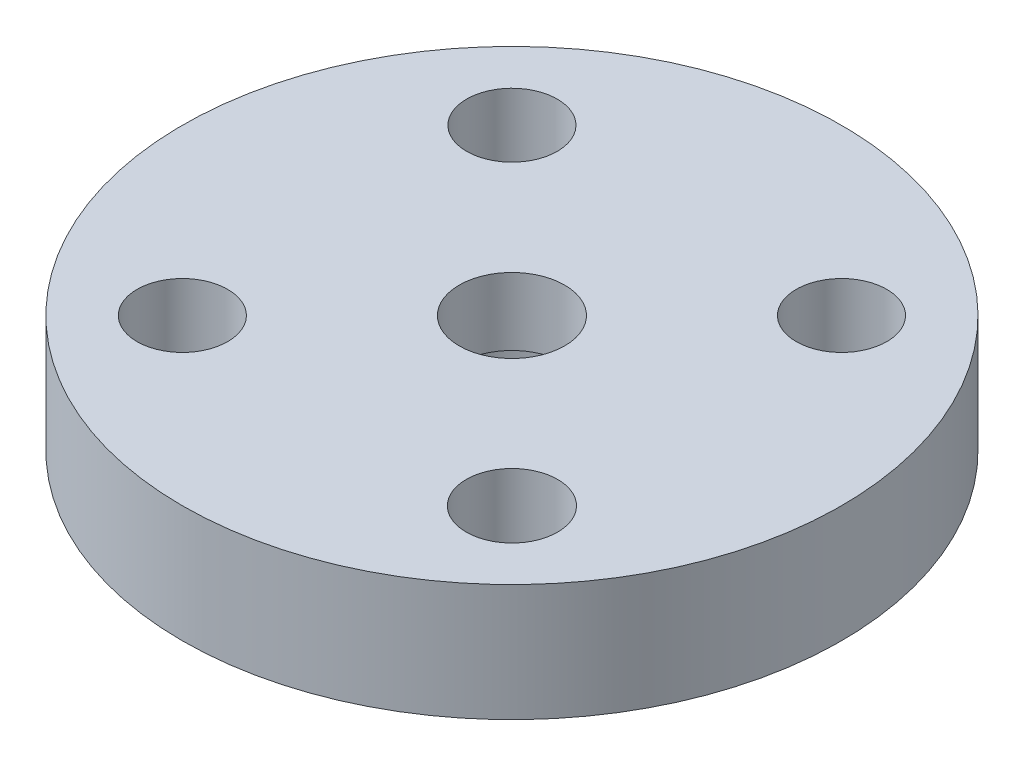
ISO-10303-21;
HEADER;
FILE_DESCRIPTION(('STEP AP214'),'2;1');
FILE_NAME('part.step','',(''),(''),'','','');
FILE_SCHEMA(('AUTOMOTIVE_DESIGN { 1 0 10303 214 1 1 1 1 }'));
ENDSEC;
DATA;
#1=APPLICATION_CONTEXT('core data for automotive mechanical design processes');
#2=APPLICATION_PROTOCOL_DEFINITION('international standard','automotive_design',2000,#1);
#3=PRODUCT_CONTEXT('',#1,'mechanical');
#4=PRODUCT('Part','Part','',(#3));
#5=PRODUCT_RELATED_PRODUCT_CATEGORY('part','',(#4));
#6=PRODUCT_DEFINITION_FORMATION('','',#4);
#7=PRODUCT_DEFINITION_CONTEXT('part definition',#1,'design');
#8=PRODUCT_DEFINITION('design','',#6,#7);
#9=PRODUCT_DEFINITION_SHAPE('','',#8);
#10=(LENGTH_UNIT() NAMED_UNIT(*) SI_UNIT(.MILLI.,.METRE.));
#11=(NAMED_UNIT(*) PLANE_ANGLE_UNIT() SI_UNIT($,.RADIAN.));
#12=(NAMED_UNIT(*) SI_UNIT($,.STERADIAN.) SOLID_ANGLE_UNIT());
#13=UNCERTAINTY_MEASURE_WITH_UNIT(LENGTH_MEASURE(1.E-05),#10,'distance_accuracy_value','');
#14=(GEOMETRIC_REPRESENTATION_CONTEXT(3) GLOBAL_UNCERTAINTY_ASSIGNED_CONTEXT((#13)) GLOBAL_UNIT_ASSIGNED_CONTEXT((#10,
#11,#12)) REPRESENTATION_CONTEXT('',''));
#15=CARTESIAN_POINT('',(0.,0.,0.));
#16=DIRECTION('',(0.,0.,1.));
#17=DIRECTION('',(1.,0.,0.));
#18=AXIS2_PLACEMENT_3D('',#15,#16,#17);
#19=CARTESIAN_POINT('',(0.,3.55,0.));
#20=DIRECTION('',(0.,-1.,0.));
#21=DIRECTION('',(0.,0.,-1.));
#22=AXIS2_PLACEMENT_3D('',#19,#20,#21);
#23=CYLINDRICAL_SURFACE('',#22,1.6);
#24=CARTESIAN_POINT('',(0.,3.55,0.));
#25=DIRECTION('',(0.,1.,0.));
#26=DIRECTION('',(0.,0.,1.));
#27=AXIS2_PLACEMENT_3D('',#24,#25,#26);
#28=CIRCLE('',#27,1.6);
#29=CARTESIAN_POINT('',(0.,3.55,1.6));
#30=VERTEX_POINT('',#29);
#31=EDGE_CURVE('E43',#30,#30,#28,.T.);
#32=ORIENTED_EDGE('',*,*,#31,.T.);
#33=EDGE_LOOP('',(#32));
#34=FACE_BOUND('',#33,.T.);
#35=CARTESIAN_POINT('',(0.,1.5,0.));
#36=DIRECTION('',(0.,-1.,0.));
#37=DIRECTION('',(0.,0.,-1.));
#38=AXIS2_PLACEMENT_3D('',#35,#36,#37);
#39=CIRCLE('',#38,1.6);
#40=CARTESIAN_POINT('',(0.,1.5,-1.6));
#41=VERTEX_POINT('',#40);
#42=EDGE_CURVE('E34',#41,#41,#39,.T.);
#43=ORIENTED_EDGE('',*,*,#42,.T.);
#44=EDGE_LOOP('',(#43));
#45=FACE_BOUND('',#44,.T.);
#46=ADVANCED_FACE('F30',(#34,#45),#23,.F.);
#47=CARTESIAN_POINT('',(0.,3.55,0.));
#48=DIRECTION('',(0.,1.,0.));
#49=DIRECTION('',(0.,0.,1.));
#50=AXIS2_PLACEMENT_3D('',#47,#48,#49);
#51=PLANE('',#50);
#52=CARTESIAN_POINT('',(5.,3.55,-5.00000000000002));
#53=DIRECTION('',(0.,1.,0.));
#54=DIRECTION('',(0.,0.,1.));
#55=AXIS2_PLACEMENT_3D('',#52,#53,#54);
#56=CIRCLE('',#55,1.375);
#57=CARTESIAN_POINT('',(5.,3.55,-3.62500000000002));
#58=VERTEX_POINT('',#57);
#59=EDGE_CURVE('E68',#58,#58,#56,.T.);
#60=ORIENTED_EDGE('',*,*,#59,.F.);
#61=EDGE_LOOP('',(#60));
#62=FACE_BOUND('',#61,.T.);
#63=CARTESIAN_POINT('',(-5.,3.55,5.00000000000002));
#64=DIRECTION('',(0.,1.,0.));
#65=DIRECTION('',(0.,0.,1.));
#66=AXIS2_PLACEMENT_3D('',#63,#64,#65);
#67=CIRCLE('',#66,1.375);
#68=CARTESIAN_POINT('',(-5.,3.55,6.37500000000002));
#69=VERTEX_POINT('',#68);
#70=EDGE_CURVE('E80',#69,#69,#67,.T.);
#71=ORIENTED_EDGE('',*,*,#70,.F.);
#72=EDGE_LOOP('',(#71));
#73=FACE_BOUND('',#72,.T.);
#74=CARTESIAN_POINT('',(0.,3.55,0.));
#75=DIRECTION('',(0.,1.,0.));
#76=DIRECTION('',(0.,0.,1.));
#77=AXIS2_PLACEMENT_3D('',#74,#75,#76);
#78=CIRCLE('',#77,10.);
#79=CARTESIAN_POINT('',(0.,3.55,10.));
#80=VERTEX_POINT('',#79);
#81=EDGE_CURVE('E10',#80,#80,#78,.T.);
#82=ORIENTED_EDGE('',*,*,#81,.T.);
#83=EDGE_LOOP('',(#82));
#84=FACE_BOUND('',#83,.T.);
#85=ORIENTED_EDGE('',*,*,#31,.F.);
#86=EDGE_LOOP('',(#85));
#87=FACE_BOUND('',#86,.T.);
#88=CARTESIAN_POINT('',(5.,3.55,5.00000000000002));
#89=DIRECTION('',(0.,1.,0.));
#90=DIRECTION('',(0.,0.,1.));
#91=AXIS2_PLACEMENT_3D('',#88,#89,#90);
#92=CIRCLE('',#91,1.38637674729393);
#93=CARTESIAN_POINT('',(5.,3.55,6.38637674729394));
#94=VERTEX_POINT('',#93);
#95=EDGE_CURVE('E74',#94,#94,#92,.T.);
#96=ORIENTED_EDGE('',*,*,#95,.F.);
#97=EDGE_LOOP('',(#96));
#98=FACE_BOUND('',#97,.T.);
#99=CARTESIAN_POINT('',(-5.,3.55,-5.00000000000002));
#100=DIRECTION('',(0.,1.,0.));
#101=DIRECTION('',(0.,0.,1.));
#102=AXIS2_PLACEMENT_3D('',#99,#100,#101);
#103=CIRCLE('',#102,1.375);
#104=CARTESIAN_POINT('',(-5.,3.55,-3.62500000000002));
#105=VERTEX_POINT('',#104);
#106=EDGE_CURVE('E54',#105,#105,#103,.T.);
#107=ORIENTED_EDGE('',*,*,#106,.F.);
#108=EDGE_LOOP('',(#107));
#109=FACE_BOUND('',#108,.T.);
#110=ADVANCED_FACE('F103',(#62,#73,#84,#87,#98,#109),#51,.T.);
#111=CARTESIAN_POINT('',(0.,0.,0.));
#112=DIRECTION('',(0.,1.,0.));
#113=DIRECTION('',(0.,0.,1.));
#114=AXIS2_PLACEMENT_3D('',#111,#112,#113);
#115=PLANE('',#114);
#116=CARTESIAN_POINT('',(0.,0.,0.));
#117=DIRECTION('',(0.,1.,0.));
#118=DIRECTION('',(0.,0.,1.));
#119=AXIS2_PLACEMENT_3D('',#116,#117,#118);
#120=CIRCLE('',#119,4.5);
#121=CARTESIAN_POINT('',(0.,0.,4.5));
#122=VERTEX_POINT('',#121);
#123=EDGE_CURVE('E47',#122,#122,#120,.T.);
#124=ORIENTED_EDGE('',*,*,#123,.T.);
#125=EDGE_LOOP('',(#124));
#126=FACE_BOUND('',#125,.T.);
#127=CARTESIAN_POINT('',(0.,0.,0.));
#128=DIRECTION('',(0.,1.,0.));
#129=DIRECTION('',(0.,0.,1.));
#130=AXIS2_PLACEMENT_3D('',#127,#128,#129);
#131=CIRCLE('',#130,10.);
#132=CARTESIAN_POINT('',(0.,0.,10.));
#133=VERTEX_POINT('',#132);
#134=EDGE_CURVE('E38',#133,#133,#131,.T.);
#135=ORIENTED_EDGE('',*,*,#134,.F.);
#136=EDGE_LOOP('',(#135));
#137=FACE_BOUND('',#136,.T.);
#138=CARTESIAN_POINT('',(-5.,0.,5.00000000000002));
#139=DIRECTION('',(0.,1.,0.));
#140=DIRECTION('',(0.,0.,1.));
#141=AXIS2_PLACEMENT_3D('',#138,#139,#140);
#142=CIRCLE('',#141,1.375);
#143=CARTESIAN_POINT('',(-5.,0.,6.37500000000002));
#144=VERTEX_POINT('',#143);
#145=EDGE_CURVE('E77',#144,#144,#142,.T.);
#146=ORIENTED_EDGE('',*,*,#145,.T.);
#147=EDGE_LOOP('',(#146));
#148=FACE_BOUND('',#147,.T.);
#149=CARTESIAN_POINT('',(5.,0.,5.00000000000002));
#150=DIRECTION('',(0.,1.,0.));
#151=DIRECTION('',(0.,0.,1.));
#152=AXIS2_PLACEMENT_3D('',#149,#150,#151);
#153=CIRCLE('',#152,1.38637674729393);
#154=CARTESIAN_POINT('',(5.,0.,6.38637674729394));
#155=VERTEX_POINT('',#154);
#156=EDGE_CURVE('E71',#155,#155,#153,.T.);
#157=ORIENTED_EDGE('',*,*,#156,.T.);
#158=EDGE_LOOP('',(#157));
#159=FACE_BOUND('',#158,.T.);
#160=CARTESIAN_POINT('',(5.,0.,-5.00000000000002));
#161=DIRECTION('',(0.,1.,0.));
#162=DIRECTION('',(0.,0.,1.));
#163=AXIS2_PLACEMENT_3D('',#160,#161,#162);
#164=CIRCLE('',#163,1.375);
#165=CARTESIAN_POINT('',(5.,0.,-3.62500000000002));
#166=VERTEX_POINT('',#165);
#167=EDGE_CURVE('E66',#166,#166,#164,.T.);
#168=ORIENTED_EDGE('',*,*,#167,.T.);
#169=EDGE_LOOP('',(#168));
#170=FACE_BOUND('',#169,.T.);
#171=CARTESIAN_POINT('',(-5.,0.,-5.00000000000002));
#172=DIRECTION('',(0.,1.,0.));
#173=DIRECTION('',(0.,0.,1.));
#174=AXIS2_PLACEMENT_3D('',#171,#172,#173);
#175=CIRCLE('',#174,1.375);
#176=CARTESIAN_POINT('',(-5.,0.,-3.62500000000002));
#177=VERTEX_POINT('',#176);
#178=EDGE_CURVE('E49',#177,#177,#175,.T.);
#179=ORIENTED_EDGE('',*,*,#178,.T.);
#180=EDGE_LOOP('',(#179));
#181=FACE_BOUND('',#180,.T.);
#182=ADVANCED_FACE('F85',(#126,#137,#148,#159,#170,#181),#115,.F.);
#183=CARTESIAN_POINT('',(0.,3.55,0.));
#184=DIRECTION('',(0.,-1.,0.));
#185=DIRECTION('',(0.,0.,-1.));
#186=AXIS2_PLACEMENT_3D('',#183,#184,#185);
#187=CYLINDRICAL_SURFACE('',#186,10.);
#188=ORIENTED_EDGE('',*,*,#81,.F.);
#189=EDGE_LOOP('',(#188));
#190=FACE_BOUND('',#189,.T.);
#191=ORIENTED_EDGE('',*,*,#134,.T.);
#192=EDGE_LOOP('',(#191));
#193=FACE_BOUND('',#192,.T.);
#194=ADVANCED_FACE('F32',(#190,#193),#187,.T.);
#195=CARTESIAN_POINT('',(-5.,3.55,5.00000000000002));
#196=DIRECTION('',(0.,-1.,0.));
#197=DIRECTION('',(0.,0.,-1.));
#198=AXIS2_PLACEMENT_3D('',#195,#196,#197);
#199=CYLINDRICAL_SURFACE('',#198,1.375);
#200=ORIENTED_EDGE('',*,*,#70,.T.);
#201=EDGE_LOOP('',(#200));
#202=FACE_BOUND('',#201,.T.);
#203=ORIENTED_EDGE('',*,*,#145,.F.);
#204=EDGE_LOOP('',(#203));
#205=FACE_BOUND('',#204,.T.);
#206=ADVANCED_FACE('F88',(#202,#205),#199,.F.);
#207=CARTESIAN_POINT('',(5.,3.55,5.00000000000002));
#208=DIRECTION('',(0.,-1.,0.));
#209=DIRECTION('',(0.,0.,-1.));
#210=AXIS2_PLACEMENT_3D('',#207,#208,#209);
#211=CYLINDRICAL_SURFACE('',#210,1.38637674729393);
#212=ORIENTED_EDGE('',*,*,#95,.T.);
#213=EDGE_LOOP('',(#212));
#214=FACE_BOUND('',#213,.T.);
#215=ORIENTED_EDGE('',*,*,#156,.F.);
#216=EDGE_LOOP('',(#215));
#217=FACE_BOUND('',#216,.T.);
#218=ADVANCED_FACE('F90',(#214,#217),#211,.F.);
#219=CARTESIAN_POINT('',(5.,3.55,-5.00000000000002));
#220=DIRECTION('',(0.,-1.,0.));
#221=DIRECTION('',(0.,0.,-1.));
#222=AXIS2_PLACEMENT_3D('',#219,#220,#221);
#223=CYLINDRICAL_SURFACE('',#222,1.375);
#224=ORIENTED_EDGE('',*,*,#59,.T.);
#225=EDGE_LOOP('',(#224));
#226=FACE_BOUND('',#225,.T.);
#227=ORIENTED_EDGE('',*,*,#167,.F.);
#228=EDGE_LOOP('',(#227));
#229=FACE_BOUND('',#228,.T.);
#230=ADVANCED_FACE('F97',(#226,#229),#223,.F.);
#231=CARTESIAN_POINT('',(-5.,3.55,-5.00000000000002));
#232=DIRECTION('',(0.,-1.,0.));
#233=DIRECTION('',(0.,0.,-1.));
#234=AXIS2_PLACEMENT_3D('',#231,#232,#233);
#235=CYLINDRICAL_SURFACE('',#234,1.375);
#236=ORIENTED_EDGE('',*,*,#106,.T.);
#237=EDGE_LOOP('',(#236));
#238=FACE_BOUND('',#237,.T.);
#239=ORIENTED_EDGE('',*,*,#178,.F.);
#240=EDGE_LOOP('',(#239));
#241=FACE_BOUND('',#240,.T.);
#242=ADVANCED_FACE('F146',(#238,#241),#235,.F.);
#243=CARTESIAN_POINT('',(0.,0.,0.));
#244=DIRECTION('',(0.,1.,0.));
#245=DIRECTION('',(0.,0.,1.));
#246=AXIS2_PLACEMENT_3D('',#243,#244,#245);
#247=CYLINDRICAL_SURFACE('',#246,2.8);
#248=CARTESIAN_POINT('',(0.,-2.,0.));
#249=DIRECTION('',(0.,1.,0.));
#250=DIRECTION('',(0.,0.,1.));
#251=AXIS2_PLACEMENT_3D('',#248,#249,#250);
#252=CIRCLE('',#251,2.8);
#253=CARTESIAN_POINT('',(0.,-2.,2.8));
#254=VERTEX_POINT('',#253);
#255=EDGE_CURVE('E57',#254,#254,#252,.T.);
#256=ORIENTED_EDGE('',*,*,#255,.F.);
#257=EDGE_LOOP('',(#256));
#258=FACE_BOUND('',#257,.T.);
#259=CARTESIAN_POINT('',(0.,1.5,0.));
#260=DIRECTION('',(0.,-1.,0.));
#261=DIRECTION('',(0.,0.,-1.));
#262=AXIS2_PLACEMENT_3D('',#259,#260,#261);
#263=CIRCLE('',#262,2.8);
#264=CARTESIAN_POINT('',(0.,1.5,-2.8));
#265=VERTEX_POINT('',#264);
#266=EDGE_CURVE('E210',#265,#265,#263,.T.);
#267=ORIENTED_EDGE('',*,*,#266,.F.);
#268=EDGE_LOOP('',(#267));
#269=FACE_BOUND('',#268,.T.);
#270=ADVANCED_FACE('F155',(#258,#269),#247,.F.);
#271=CARTESIAN_POINT('',(0.,0.,0.));
#272=DIRECTION('',(0.,1.,0.));
#273=DIRECTION('',(0.,0.,1.));
#274=AXIS2_PLACEMENT_3D('',#271,#272,#273);
#275=CYLINDRICAL_SURFACE('',#274,4.5);
#276=CARTESIAN_POINT('',(0.,-2.,0.));
#277=DIRECTION('',(0.,1.,0.));
#278=DIRECTION('',(0.,0.,1.));
#279=AXIS2_PLACEMENT_3D('',#276,#277,#278);
#280=CIRCLE('',#279,4.5);
#281=CARTESIAN_POINT('',(0.,-2.,4.5));
#282=VERTEX_POINT('',#281);
#283=EDGE_CURVE('E50',#282,#282,#280,.T.);
#284=ORIENTED_EDGE('',*,*,#283,.T.);
#285=EDGE_LOOP('',(#284));
#286=FACE_BOUND('',#285,.T.);
#287=ORIENTED_EDGE('',*,*,#123,.F.);
#288=EDGE_LOOP('',(#287));
#289=FACE_BOUND('',#288,.T.);
#290=ADVANCED_FACE('F166',(#286,#289),#275,.T.);
#291=CARTESIAN_POINT('',(-4.5,-2.,0.));
#292=DIRECTION('',(0.,-1.,0.));
#293=DIRECTION('',(0.,0.,-1.));
#294=AXIS2_PLACEMENT_3D('',#291,#292,#293);
#295=PLANE('',#294);
#296=ORIENTED_EDGE('',*,*,#255,.T.);
#297=EDGE_LOOP('',(#296));
#298=FACE_BOUND('',#297,.T.);
#299=ORIENTED_EDGE('',*,*,#283,.F.);
#300=EDGE_LOOP('',(#299));
#301=FACE_BOUND('',#300,.T.);
#302=ADVANCED_FACE('F174',(#298,#301),#295,.T.);
#303=CARTESIAN_POINT('',(0.,1.5,0.));
#304=DIRECTION('',(0.,-1.,0.));
#305=DIRECTION('',(0.,0.,-1.));
#306=AXIS2_PLACEMENT_3D('',#303,#304,#305);
#307=PLANE('',#306);
#308=ORIENTED_EDGE('',*,*,#42,.F.);
#309=EDGE_LOOP('',(#308));
#310=FACE_BOUND('',#309,.T.);
#311=ORIENTED_EDGE('',*,*,#266,.T.);
#312=EDGE_LOOP('',(#311));
#313=FACE_BOUND('',#312,.T.);
#314=ADVANCED_FACE('F181',(#310,#313),#307,.T.);
#315=CLOSED_SHELL('',(#46,#110,#182,#194,#206,#218,#230,#242,#270,#290,#302,#314));
#316=MANIFOLD_SOLID_BREP('B2',#315);
#317=ADVANCED_BREP_SHAPE_REPRESENTATION('',(#18,#316),#14);
#318=SHAPE_DEFINITION_REPRESENTATION(#9,#317);
ENDSEC;
END-ISO-10303-21;
